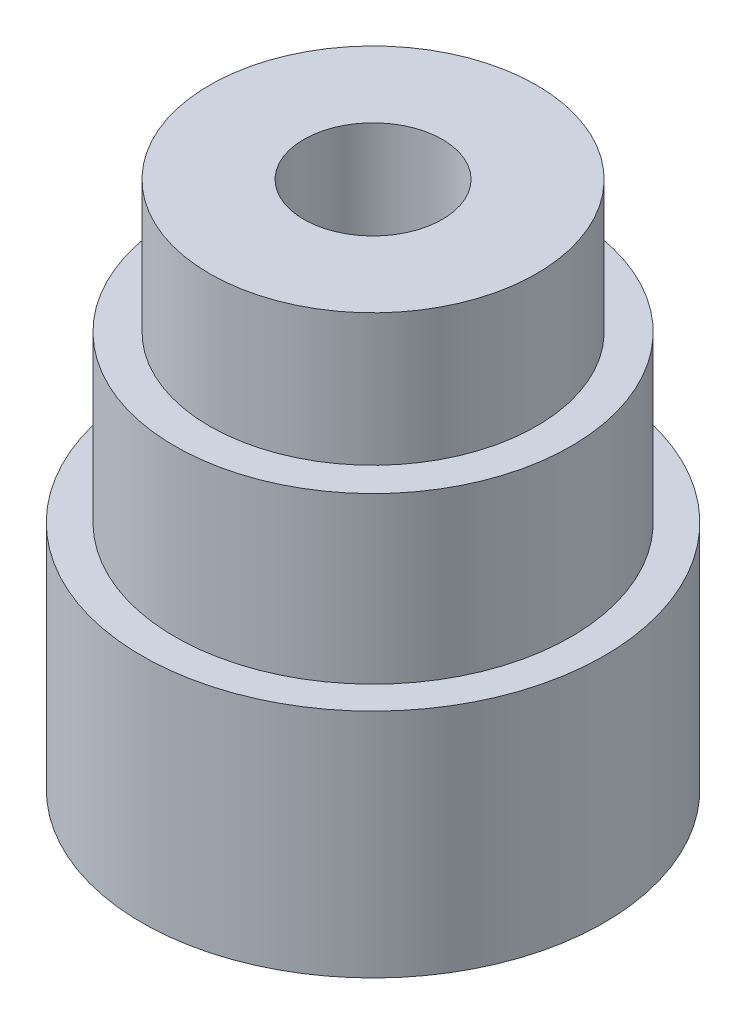
ISO-10303-21;
HEADER;
FILE_DESCRIPTION(('STEP AP214'),'2;1');
FILE_NAME('part.step','',(''),(''),'','','');
FILE_SCHEMA(('AUTOMOTIVE_DESIGN { 1 0 10303 214 1 1 1 1 }'));
ENDSEC;
DATA;
#1=APPLICATION_CONTEXT('core data for automotive mechanical design processes');
#2=APPLICATION_PROTOCOL_DEFINITION('international standard','automotive_design',2000,#1);
#3=PRODUCT_CONTEXT('',#1,'mechanical');
#4=PRODUCT('Part','Part','',(#3));
#5=PRODUCT_RELATED_PRODUCT_CATEGORY('part','',(#4));
#6=PRODUCT_DEFINITION_FORMATION('','',#4);
#7=PRODUCT_DEFINITION_CONTEXT('part definition',#1,'design');
#8=PRODUCT_DEFINITION('design','',#6,#7);
#9=PRODUCT_DEFINITION_SHAPE('','',#8);
#10=(LENGTH_UNIT() NAMED_UNIT(*) SI_UNIT(.MILLI.,.METRE.));
#11=(NAMED_UNIT(*) PLANE_ANGLE_UNIT() SI_UNIT($,.RADIAN.));
#12=(NAMED_UNIT(*) SI_UNIT($,.STERADIAN.) SOLID_ANGLE_UNIT());
#13=UNCERTAINTY_MEASURE_WITH_UNIT(LENGTH_MEASURE(1.E-05),#10,'distance_accuracy_value','');
#14=(GEOMETRIC_REPRESENTATION_CONTEXT(3) GLOBAL_UNCERTAINTY_ASSIGNED_CONTEXT((#13)) GLOBAL_UNIT_ASSIGNED_CONTEXT((#10,
#11,#12)) REPRESENTATION_CONTEXT('',''));
#15=CARTESIAN_POINT('',(0.,0.,0.));
#16=DIRECTION('',(0.,0.,1.));
#17=DIRECTION('',(1.,0.,0.));
#18=AXIS2_PLACEMENT_3D('',#15,#16,#17);
#19=CARTESIAN_POINT('',(-7.,0.,0.));
#20=DIRECTION('',(0.,1.,0.));
#21=DIRECTION('',(0.,0.,1.));
#22=AXIS2_PLACEMENT_3D('',#19,#20,#21);
#23=PLANE('',#22);
#24=CARTESIAN_POINT('',(0.,0.,0.));
#25=DIRECTION('',(0.,1.,0.));
#26=DIRECTION('',(0.,0.,1.));
#27=AXIS2_PLACEMENT_3D('',#24,#25,#26);
#28=CIRCLE('',#27,2.1);
#29=CARTESIAN_POINT('',(0.,0.,2.1));
#30=VERTEX_POINT('',#29);
#31=EDGE_CURVE('E64',#30,#30,#28,.T.);
#32=ORIENTED_EDGE('',*,*,#31,.T.);
#33=EDGE_LOOP('',(#32));
#34=FACE_BOUND('',#33,.T.);
#35=CARTESIAN_POINT('',(0.,0.,0.));
#36=DIRECTION('',(0.,-1.,0.));
#37=DIRECTION('',(0.,0.,-1.));
#38=AXIS2_PLACEMENT_3D('',#35,#36,#37);
#39=CIRCLE('',#38,7.);
#40=CARTESIAN_POINT('',(0.,0.,-7.));
#41=VERTEX_POINT('',#40);
#42=EDGE_CURVE('E61',#41,#41,#39,.T.);
#43=ORIENTED_EDGE('',*,*,#42,.T.);
#44=EDGE_LOOP('',(#43));
#45=FACE_BOUND('',#44,.T.);
#46=ADVANCED_FACE('F39',(#34,#45),#23,.F.);
#47=CARTESIAN_POINT('',(0.,16.,0.));
#48=DIRECTION('',(0.,-1.,0.));
#49=DIRECTION('',(0.,0.,-1.));
#50=AXIS2_PLACEMENT_3D('',#47,#48,#49);
#51=PLANE('',#50);
#52=CARTESIAN_POINT('',(0.,16.,0.));
#53=DIRECTION('',(0.,1.,0.));
#54=DIRECTION('',(-1.,0.,0.));
#55=AXIS2_PLACEMENT_3D('',#52,#53,#54);
#56=CIRCLE('',#55,2.1);
#57=CARTESIAN_POINT('',(-2.1,16.,0.));
#58=VERTEX_POINT('',#57);
#59=EDGE_CURVE('E67',#58,#58,#56,.T.);
#60=ORIENTED_EDGE('',*,*,#59,.F.);
#61=EDGE_LOOP('',(#60));
#62=FACE_BOUND('',#61,.T.);
#63=CARTESIAN_POINT('',(0.,16.,0.));
#64=DIRECTION('',(0.,-1.,0.));
#65=DIRECTION('',(0.,0.,-1.));
#66=AXIS2_PLACEMENT_3D('',#63,#64,#65);
#67=CIRCLE('',#66,4.95);
#68=CARTESIAN_POINT('',(0.,16.,-4.95));
#69=VERTEX_POINT('',#68);
#70=EDGE_CURVE('E10',#69,#69,#67,.T.);
#71=ORIENTED_EDGE('',*,*,#70,.F.);
#72=EDGE_LOOP('',(#71));
#73=FACE_BOUND('',#72,.T.);
#74=ADVANCED_FACE('F74',(#62,#73),#51,.F.);
#75=CARTESIAN_POINT('',(0.,0.,0.));
#76=DIRECTION('',(0.,-1.,0.));
#77=DIRECTION('',(0.,0.,-1.));
#78=AXIS2_PLACEMENT_3D('',#75,#76,#77);
#79=CYLINDRICAL_SURFACE('',#78,4.95);
#80=CARTESIAN_POINT('',(0.,12.,0.));
#81=DIRECTION('',(0.,-1.,0.));
#82=DIRECTION('',(0.,0.,-1.));
#83=AXIS2_PLACEMENT_3D('',#80,#81,#82);
#84=CIRCLE('',#83,4.95);
#85=CARTESIAN_POINT('',(0.,12.,-4.95));
#86=VERTEX_POINT('',#85);
#87=EDGE_CURVE('E45',#86,#86,#84,.T.);
#88=ORIENTED_EDGE('',*,*,#87,.F.);
#89=EDGE_LOOP('',(#88));
#90=FACE_BOUND('',#89,.T.);
#91=ORIENTED_EDGE('',*,*,#70,.T.);
#92=EDGE_LOOP('',(#91));
#93=FACE_BOUND('',#92,.T.);
#94=ADVANCED_FACE('F77',(#90,#93),#79,.T.);
#95=CARTESIAN_POINT('',(-4.95,12.,0.));
#96=DIRECTION('',(0.,-1.,0.));
#97=DIRECTION('',(0.,0.,-1.));
#98=AXIS2_PLACEMENT_3D('',#95,#96,#97);
#99=PLANE('',#98);
#100=CARTESIAN_POINT('',(0.,12.,0.));
#101=DIRECTION('',(0.,-1.,0.));
#102=DIRECTION('',(0.,0.,-1.));
#103=AXIS2_PLACEMENT_3D('',#100,#101,#102);
#104=CIRCLE('',#103,6.);
#105=CARTESIAN_POINT('',(0.,12.,-6.));
#106=VERTEX_POINT('',#105);
#107=EDGE_CURVE('E49',#106,#106,#104,.T.);
#108=ORIENTED_EDGE('',*,*,#107,.F.);
#109=EDGE_LOOP('',(#108));
#110=FACE_BOUND('',#109,.T.);
#111=ORIENTED_EDGE('',*,*,#87,.T.);
#112=EDGE_LOOP('',(#111));
#113=FACE_BOUND('',#112,.T.);
#114=ADVANCED_FACE('F83',(#110,#113),#99,.F.);
#115=CARTESIAN_POINT('',(0.,0.,0.));
#116=DIRECTION('',(0.,-1.,0.));
#117=DIRECTION('',(0.,0.,-1.));
#118=AXIS2_PLACEMENT_3D('',#115,#116,#117);
#119=CYLINDRICAL_SURFACE('',#118,6.);
#120=CARTESIAN_POINT('',(0.,7.,0.));
#121=DIRECTION('',(0.,-1.,0.));
#122=DIRECTION('',(0.,0.,-1.));
#123=AXIS2_PLACEMENT_3D('',#120,#121,#122);
#124=CIRCLE('',#123,6.);
#125=CARTESIAN_POINT('',(0.,7.,-6.));
#126=VERTEX_POINT('',#125);
#127=EDGE_CURVE('E53',#126,#126,#124,.T.);
#128=ORIENTED_EDGE('',*,*,#127,.F.);
#129=EDGE_LOOP('',(#128));
#130=FACE_BOUND('',#129,.T.);
#131=ORIENTED_EDGE('',*,*,#107,.T.);
#132=EDGE_LOOP('',(#131));
#133=FACE_BOUND('',#132,.T.);
#134=ADVANCED_FACE('F90',(#130,#133),#119,.T.);
#135=CARTESIAN_POINT('',(-6.,7.,0.));
#136=DIRECTION('',(0.,-1.,0.));
#137=DIRECTION('',(0.,0.,-1.));
#138=AXIS2_PLACEMENT_3D('',#135,#136,#137);
#139=PLANE('',#138);
#140=CARTESIAN_POINT('',(0.,7.,0.));
#141=DIRECTION('',(0.,-1.,0.));
#142=DIRECTION('',(0.,0.,-1.));
#143=AXIS2_PLACEMENT_3D('',#140,#141,#142);
#144=CIRCLE('',#143,7.);
#145=CARTESIAN_POINT('',(0.,7.,-7.));
#146=VERTEX_POINT('',#145);
#147=EDGE_CURVE('E58',#146,#146,#144,.T.);
#148=ORIENTED_EDGE('',*,*,#147,.F.);
#149=EDGE_LOOP('',(#148));
#150=FACE_BOUND('',#149,.T.);
#151=ORIENTED_EDGE('',*,*,#127,.T.);
#152=EDGE_LOOP('',(#151));
#153=FACE_BOUND('',#152,.T.);
#154=ADVANCED_FACE('F94',(#150,#153),#139,.F.);
#155=CARTESIAN_POINT('',(0.,0.,0.));
#156=DIRECTION('',(0.,-1.,0.));
#157=DIRECTION('',(0.,0.,-1.));
#158=AXIS2_PLACEMENT_3D('',#155,#156,#157);
#159=CYLINDRICAL_SURFACE('',#158,7.);
#160=ORIENTED_EDGE('',*,*,#42,.F.);
#161=EDGE_LOOP('',(#160));
#162=FACE_BOUND('',#161,.T.);
#163=ORIENTED_EDGE('',*,*,#147,.T.);
#164=EDGE_LOOP('',(#163));
#165=FACE_BOUND('',#164,.T.);
#166=ADVANCED_FACE('F98',(#162,#165),#159,.T.);
#167=CARTESIAN_POINT('',(0.,-3.,0.));
#168=DIRECTION('',(0.,1.,0.));
#169=DIRECTION('',(-1.,0.,0.));
#170=AXIS2_PLACEMENT_3D('',#167,#168,#169);
#171=CYLINDRICAL_SURFACE('',#170,2.1);
#172=ORIENTED_EDGE('',*,*,#59,.T.);
#173=EDGE_LOOP('',(#172));
#174=FACE_BOUND('',#173,.T.);
#175=ORIENTED_EDGE('',*,*,#31,.F.);
#176=EDGE_LOOP('',(#175));
#177=FACE_BOUND('',#176,.T.);
#178=ADVANCED_FACE('F71',(#174,#177),#171,.F.);
#179=CLOSED_SHELL('',(#46,#74,#94,#114,#134,#154,#166,#178));
#180=MANIFOLD_SOLID_BREP('B2',#179);
#181=ADVANCED_BREP_SHAPE_REPRESENTATION('',(#18,#180),#14);
#182=SHAPE_DEFINITION_REPRESENTATION(#9,#181);
ENDSEC;
END-ISO-10303-21;
